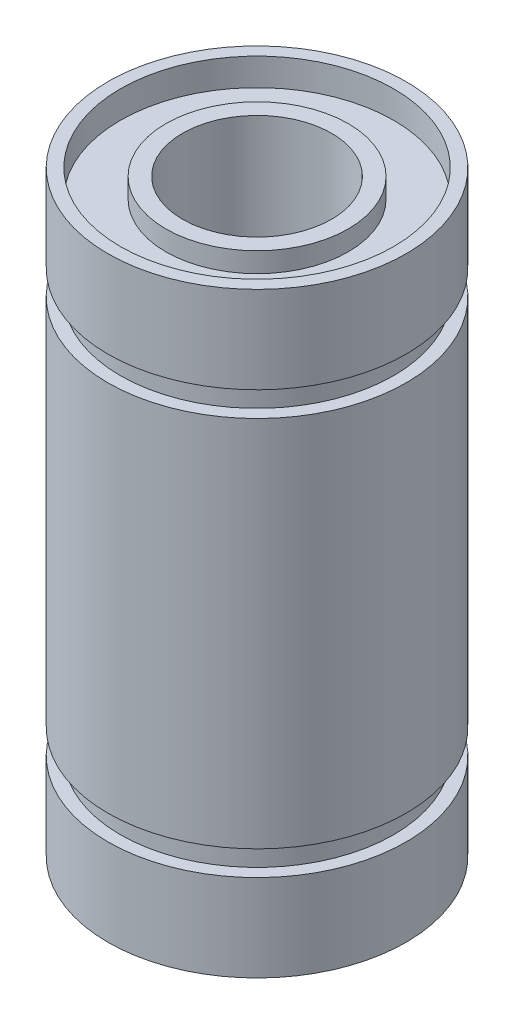
ISO-10303-21;
HEADER;
FILE_DESCRIPTION(('STEP AP214'),'2;1');
FILE_NAME('part.step','',(''),(''),'','','');
FILE_SCHEMA(('AUTOMOTIVE_DESIGN { 1 0 10303 214 1 1 1 1 }'));
ENDSEC;
DATA;
#1=APPLICATION_CONTEXT('core data for automotive mechanical design processes');
#2=APPLICATION_PROTOCOL_DEFINITION('international standard','automotive_design',2000,#1);
#3=PRODUCT_CONTEXT('',#1,'mechanical');
#4=PRODUCT('Part','Part','',(#3));
#5=PRODUCT_RELATED_PRODUCT_CATEGORY('part','',(#4));
#6=PRODUCT_DEFINITION_FORMATION('','',#4);
#7=PRODUCT_DEFINITION_CONTEXT('part definition',#1,'design');
#8=PRODUCT_DEFINITION('design','',#6,#7);
#9=PRODUCT_DEFINITION_SHAPE('','',#8);
#10=(LENGTH_UNIT() NAMED_UNIT(*) SI_UNIT(.MILLI.,.METRE.));
#11=(NAMED_UNIT(*) PLANE_ANGLE_UNIT() SI_UNIT($,.RADIAN.));
#12=(NAMED_UNIT(*) SI_UNIT($,.STERADIAN.) SOLID_ANGLE_UNIT());
#13=UNCERTAINTY_MEASURE_WITH_UNIT(LENGTH_MEASURE(1.E-05),#10,'distance_accuracy_value','');
#14=(GEOMETRIC_REPRESENTATION_CONTEXT(3) GLOBAL_UNCERTAINTY_ASSIGNED_CONTEXT((#13)) GLOBAL_UNIT_ASSIGNED_CONTEXT((#10,
#11,#12)) REPRESENTATION_CONTEXT('',''));
#15=CARTESIAN_POINT('',(0.,0.,0.));
#16=DIRECTION('',(0.,0.,1.));
#17=DIRECTION('',(1.,0.,0.));
#18=AXIS2_PLACEMENT_3D('',#15,#16,#17);
#19=CARTESIAN_POINT('',(0.,-12.,0.));
#20=DIRECTION('',(0.,1.,0.));
#21=DIRECTION('',(0.,0.,1.));
#22=AXIS2_PLACEMENT_3D('',#19,#20,#21);
#23=CYLINDRICAL_SURFACE('',#22,3.);
#24=CARTESIAN_POINT('',(0.,11.7,0.));
#25=DIRECTION('',(0.,1.,0.));
#26=DIRECTION('',(0.,0.,1.));
#27=AXIS2_PLACEMENT_3D('',#24,#25,#26);
#28=CIRCLE('',#27,3.);
#29=CARTESIAN_POINT('',(0.,11.7,3.));
#30=VERTEX_POINT('',#29);
#31=EDGE_CURVE('E72',#30,#30,#28,.T.);
#32=ORIENTED_EDGE('',*,*,#31,.T.);
#33=EDGE_LOOP('',(#32));
#34=FACE_BOUND('',#33,.T.);
#35=CARTESIAN_POINT('',(0.,-11.7,0.));
#36=DIRECTION('',(0.,1.,0.));
#37=DIRECTION('',(0.,0.,1.));
#38=AXIS2_PLACEMENT_3D('',#35,#36,#37);
#39=CIRCLE('',#38,3.);
#40=CARTESIAN_POINT('',(0.,-11.7,3.));
#41=VERTEX_POINT('',#40);
#42=EDGE_CURVE('E99',#41,#41,#39,.T.);
#43=ORIENTED_EDGE('',*,*,#42,.F.);
#44=EDGE_LOOP('',(#43));
#45=FACE_BOUND('',#44,.T.);
#46=ADVANCED_FACE('F45',(#34,#45),#23,.F.);
#47=CARTESIAN_POINT('',(0.,-12.,0.));
#48=DIRECTION('',(0.,1.,0.));
#49=DIRECTION('',(0.,0.,1.));
#50=AXIS2_PLACEMENT_3D('',#47,#48,#49);
#51=PLANE('',#50);
#52=CARTESIAN_POINT('',(0.,-12.,0.));
#53=DIRECTION('',(0.,1.,0.));
#54=DIRECTION('',(0.,0.,1.));
#55=AXIS2_PLACEMENT_3D('',#52,#53,#54);
#56=CIRCLE('',#55,6.);
#57=CARTESIAN_POINT('',(0.,-12.,6.));
#58=VERTEX_POINT('',#57);
#59=EDGE_CURVE('E49',#58,#58,#56,.T.);
#60=ORIENTED_EDGE('',*,*,#59,.F.);
#61=EDGE_LOOP('',(#60));
#62=FACE_BOUND('',#61,.T.);
#63=CARTESIAN_POINT('',(0.,-12.,0.));
#64=DIRECTION('',(0.,1.,0.));
#65=DIRECTION('',(0.,0.,1.));
#66=AXIS2_PLACEMENT_3D('',#63,#64,#65);
#67=CIRCLE('',#66,5.5);
#68=CARTESIAN_POINT('',(0.,-12.,5.5));
#69=VERTEX_POINT('',#68);
#70=EDGE_CURVE('E94',#69,#69,#67,.T.);
#71=ORIENTED_EDGE('',*,*,#70,.T.);
#72=EDGE_LOOP('',(#71));
#73=FACE_BOUND('',#72,.T.);
#74=ADVANCED_FACE('F133',(#62,#73),#51,.F.);
#75=CARTESIAN_POINT('',(0.,12.,0.));
#76=DIRECTION('',(0.,-1.,0.));
#77=DIRECTION('',(0.,0.,-1.));
#78=AXIS2_PLACEMENT_3D('',#75,#76,#77);
#79=CYLINDRICAL_SURFACE('',#78,6.);
#80=CARTESIAN_POINT('',(0.,7.5,0.));
#81=DIRECTION('',(0.,1.,0.));
#82=DIRECTION('',(0.,0.,1.));
#83=AXIS2_PLACEMENT_3D('',#80,#81,#82);
#84=CIRCLE('',#83,6.);
#85=CARTESIAN_POINT('',(0.,7.5,6.));
#86=VERTEX_POINT('',#85);
#87=EDGE_CURVE('E56',#86,#86,#84,.T.);
#88=ORIENTED_EDGE('',*,*,#87,.F.);
#89=EDGE_LOOP('',(#88));
#90=FACE_BOUND('',#89,.T.);
#91=CARTESIAN_POINT('',(0.,-7.5,0.));
#92=DIRECTION('',(0.,1.,0.));
#93=DIRECTION('',(0.,0.,1.));
#94=AXIS2_PLACEMENT_3D('',#91,#92,#93);
#95=CIRCLE('',#94,6.);
#96=CARTESIAN_POINT('',(0.,-7.5,6.));
#97=VERTEX_POINT('',#96);
#98=EDGE_CURVE('E84',#97,#97,#95,.T.);
#99=ORIENTED_EDGE('',*,*,#98,.T.);
#100=EDGE_LOOP('',(#99));
#101=FACE_BOUND('',#100,.T.);
#102=ADVANCED_FACE('F140',(#90,#101),#79,.T.);
#103=CARTESIAN_POINT('',(0.,12.,0.));
#104=DIRECTION('',(0.,1.,0.));
#105=DIRECTION('',(0.,0.,1.));
#106=AXIS2_PLACEMENT_3D('',#103,#104,#105);
#107=PLANE('',#106);
#108=CARTESIAN_POINT('',(0.,12.,0.));
#109=DIRECTION('',(0.,1.,0.));
#110=DIRECTION('',(0.,0.,1.));
#111=AXIS2_PLACEMENT_3D('',#108,#109,#110);
#112=CIRCLE('',#111,6.);
#113=CARTESIAN_POINT('',(0.,12.,6.));
#114=VERTEX_POINT('',#113);
#115=EDGE_CURVE('E10',#114,#114,#112,.T.);
#116=ORIENTED_EDGE('',*,*,#115,.T.);
#117=EDGE_LOOP('',(#116));
#118=FACE_BOUND('',#117,.T.);
#119=CARTESIAN_POINT('',(0.,12.,0.));
#120=DIRECTION('',(0.,1.,0.));
#121=DIRECTION('',(0.,0.,1.));
#122=AXIS2_PLACEMENT_3D('',#119,#120,#121);
#123=CIRCLE('',#122,5.5);
#124=CARTESIAN_POINT('',(0.,12.,5.5));
#125=VERTEX_POINT('',#124);
#126=EDGE_CURVE('E67',#125,#125,#123,.T.);
#127=ORIENTED_EDGE('',*,*,#126,.F.);
#128=EDGE_LOOP('',(#127));
#129=FACE_BOUND('',#128,.T.);
#130=ADVANCED_FACE('F146',(#118,#129),#107,.T.);
#131=CARTESIAN_POINT('',(0.,-8.5,0.));
#132=DIRECTION('',(0.,1.,0.));
#133=DIRECTION('',(0.,0.,1.));
#134=AXIS2_PLACEMENT_3D('',#131,#132,#133);
#135=CIRCLE('',#134,6.);
#136=CARTESIAN_POINT('',(0.,-8.5,6.));
#137=VERTEX_POINT('',#136);
#138=EDGE_CURVE('E85',#137,#137,#135,.T.);
#139=ORIENTED_EDGE('',*,*,#138,.F.);
#140=EDGE_LOOP('',(#139));
#141=FACE_BOUND('',#140,.T.);
#142=ORIENTED_EDGE('',*,*,#59,.T.);
#143=EDGE_LOOP('',(#142));
#144=FACE_BOUND('',#143,.T.);
#145=ADVANCED_FACE('F148',(#141,#144),#79,.T.);
#146=CARTESIAN_POINT('',(0.,8.5,0.));
#147=DIRECTION('',(0.,1.,0.));
#148=DIRECTION('',(0.,0.,1.));
#149=AXIS2_PLACEMENT_3D('',#146,#147,#148);
#150=CIRCLE('',#149,6.);
#151=CARTESIAN_POINT('',(0.,8.5,6.));
#152=VERTEX_POINT('',#151);
#153=EDGE_CURVE('E58',#152,#152,#150,.T.);
#154=ORIENTED_EDGE('',*,*,#153,.T.);
#155=EDGE_LOOP('',(#154));
#156=FACE_BOUND('',#155,.T.);
#157=ORIENTED_EDGE('',*,*,#115,.F.);
#158=EDGE_LOOP('',(#157));
#159=FACE_BOUND('',#158,.T.);
#160=ADVANCED_FACE('F47',(#156,#159),#79,.T.);
#161=CARTESIAN_POINT('',(0.,7.5,0.));
#162=DIRECTION('',(0.,1.,0.));
#163=DIRECTION('',(0.,0.,1.));
#164=AXIS2_PLACEMENT_3D('',#161,#162,#163);
#165=PLANE('',#164);
#166=CARTESIAN_POINT('',(0.,7.5,0.));
#167=DIRECTION('',(0.,1.,0.));
#168=DIRECTION('',(0.,0.,1.));
#169=AXIS2_PLACEMENT_3D('',#166,#167,#168);
#170=CIRCLE('',#169,5.5);
#171=CARTESIAN_POINT('',(0.,7.5,5.5));
#172=VERTEX_POINT('',#171);
#173=EDGE_CURVE('E61',#172,#172,#170,.T.);
#174=ORIENTED_EDGE('',*,*,#173,.F.);
#175=EDGE_LOOP('',(#174));
#176=FACE_BOUND('',#175,.T.);
#177=ORIENTED_EDGE('',*,*,#87,.T.);
#178=EDGE_LOOP('',(#177));
#179=FACE_BOUND('',#178,.T.);
#180=ADVANCED_FACE('F188',(#176,#179),#165,.T.);
#181=CARTESIAN_POINT('',(0.,8.5,0.));
#182=DIRECTION('',(0.,1.,0.));
#183=DIRECTION('',(0.,0.,1.));
#184=AXIS2_PLACEMENT_3D('',#181,#182,#183);
#185=PLANE('',#184);
#186=CARTESIAN_POINT('',(0.,8.5,0.));
#187=DIRECTION('',(0.,1.,0.));
#188=DIRECTION('',(0.,0.,1.));
#189=AXIS2_PLACEMENT_3D('',#186,#187,#188);
#190=CIRCLE('',#189,5.5);
#191=CARTESIAN_POINT('',(0.,8.5,5.5));
#192=VERTEX_POINT('',#191);
#193=EDGE_CURVE('E64',#192,#192,#190,.T.);
#194=ORIENTED_EDGE('',*,*,#193,.T.);
#195=EDGE_LOOP('',(#194));
#196=FACE_BOUND('',#195,.T.);
#197=ORIENTED_EDGE('',*,*,#153,.F.);
#198=EDGE_LOOP('',(#197));
#199=FACE_BOUND('',#198,.T.);
#200=ADVANCED_FACE('F144',(#196,#199),#185,.F.);
#201=CARTESIAN_POINT('',(0.,7.5,0.));
#202=DIRECTION('',(0.,1.,0.));
#203=DIRECTION('',(0.,0.,1.));
#204=AXIS2_PLACEMENT_3D('',#201,#202,#203);
#205=CYLINDRICAL_SURFACE('',#204,5.5);
#206=ORIENTED_EDGE('',*,*,#173,.T.);
#207=EDGE_LOOP('',(#206));
#208=FACE_BOUND('',#207,.T.);
#209=ORIENTED_EDGE('',*,*,#193,.F.);
#210=EDGE_LOOP('',(#209));
#211=FACE_BOUND('',#210,.T.);
#212=ADVANCED_FACE('F163',(#208,#211),#205,.T.);
#213=CARTESIAN_POINT('',(0.,10.5,0.));
#214=DIRECTION('',(0.,1.,0.));
#215=DIRECTION('',(0.,0.,1.));
#216=AXIS2_PLACEMENT_3D('',#213,#214,#215);
#217=CYLINDRICAL_SURFACE('',#216,5.5);
#218=ORIENTED_EDGE('',*,*,#126,.T.);
#219=EDGE_LOOP('',(#218));
#220=FACE_BOUND('',#219,.T.);
#221=CARTESIAN_POINT('',(0.,10.9,0.));
#222=DIRECTION('',(0.,1.,0.));
#223=DIRECTION('',(0.,0.,1.));
#224=AXIS2_PLACEMENT_3D('',#221,#222,#223);
#225=CIRCLE('',#224,5.5);
#226=CARTESIAN_POINT('',(0.,10.9,5.5));
#227=VERTEX_POINT('',#226);
#228=EDGE_CURVE('E81',#227,#227,#225,.T.);
#229=ORIENTED_EDGE('',*,*,#228,.F.);
#230=EDGE_LOOP('',(#229));
#231=FACE_BOUND('',#230,.T.);
#232=ADVANCED_FACE('F160',(#220,#231),#217,.F.);
#233=CARTESIAN_POINT('',(0.,11.7,-3.));
#234=DIRECTION('',(0.,1.,0.));
#235=DIRECTION('',(0.,0.,1.));
#236=AXIS2_PLACEMENT_3D('',#233,#234,#235);
#237=PLANE('',#236);
#238=CARTESIAN_POINT('',(0.,11.7,0.));
#239=DIRECTION('',(0.,1.,0.));
#240=DIRECTION('',(0.,0.,1.));
#241=AXIS2_PLACEMENT_3D('',#238,#239,#240);
#242=CIRCLE('',#241,3.67076728218051);
#243=CARTESIAN_POINT('',(0.,11.7,3.67076728218051));
#244=VERTEX_POINT('',#243);
#245=EDGE_CURVE('E75',#244,#244,#242,.T.);
#246=ORIENTED_EDGE('',*,*,#245,.T.);
#247=EDGE_LOOP('',(#246));
#248=FACE_BOUND('',#247,.T.);
#249=ORIENTED_EDGE('',*,*,#31,.F.);
#250=EDGE_LOOP('',(#249));
#251=FACE_BOUND('',#250,.T.);
#252=ADVANCED_FACE('F162',(#248,#251),#237,.T.);
#253=CARTESIAN_POINT('',(0.,10.5,0.));
#254=DIRECTION('',(0.,1.,0.));
#255=DIRECTION('',(0.,0.,1.));
#256=AXIS2_PLACEMENT_3D('',#253,#254,#255);
#257=CYLINDRICAL_SURFACE('',#256,3.67076728218051);
#258=CARTESIAN_POINT('',(0.,10.9,0.));
#259=DIRECTION('',(0.,1.,0.));
#260=DIRECTION('',(0.,0.,1.));
#261=AXIS2_PLACEMENT_3D('',#258,#259,#260);
#262=CIRCLE('',#261,3.67076728218051);
#263=CARTESIAN_POINT('',(0.,10.9,3.67076728218051));
#264=VERTEX_POINT('',#263);
#265=EDGE_CURVE('E78',#264,#264,#262,.T.);
#266=ORIENTED_EDGE('',*,*,#265,.T.);
#267=EDGE_LOOP('',(#266));
#268=FACE_BOUND('',#267,.T.);
#269=ORIENTED_EDGE('',*,*,#245,.F.);
#270=EDGE_LOOP('',(#269));
#271=FACE_BOUND('',#270,.T.);
#272=ADVANCED_FACE('F171',(#268,#271),#257,.T.);
#273=CARTESIAN_POINT('',(0.,10.9,-3.67076728218051));
#274=DIRECTION('',(0.,1.,0.));
#275=DIRECTION('',(0.,0.,1.));
#276=AXIS2_PLACEMENT_3D('',#273,#274,#275);
#277=PLANE('',#276);
#278=ORIENTED_EDGE('',*,*,#228,.T.);
#279=EDGE_LOOP('',(#278));
#280=FACE_BOUND('',#279,.T.);
#281=ORIENTED_EDGE('',*,*,#265,.F.);
#282=EDGE_LOOP('',(#281));
#283=FACE_BOUND('',#282,.T.);
#284=ADVANCED_FACE('F167',(#280,#283),#277,.T.);
#285=CARTESIAN_POINT('',(0.,-7.5,0.));
#286=DIRECTION('',(0.,-1.,0.));
#287=DIRECTION('',(0.,0.,1.));
#288=AXIS2_PLACEMENT_3D('',#285,#286,#287);
#289=PLANE('',#288);
#290=ORIENTED_EDGE('',*,*,#98,.F.);
#291=EDGE_LOOP('',(#290));
#292=FACE_BOUND('',#291,.T.);
#293=CARTESIAN_POINT('',(0.,-7.5,0.));
#294=DIRECTION('',(0.,1.,0.));
#295=DIRECTION('',(0.,0.,1.));
#296=AXIS2_PLACEMENT_3D('',#293,#294,#295);
#297=CIRCLE('',#296,5.5);
#298=CARTESIAN_POINT('',(0.,-7.5,5.5));
#299=VERTEX_POINT('',#298);
#300=EDGE_CURVE('E88',#299,#299,#297,.T.);
#301=ORIENTED_EDGE('',*,*,#300,.T.);
#302=EDGE_LOOP('',(#301));
#303=FACE_BOUND('',#302,.T.);
#304=ADVANCED_FACE('F170',(#292,#303),#289,.T.);
#305=CARTESIAN_POINT('',(0.,-8.5,0.));
#306=DIRECTION('',(0.,-1.,0.));
#307=DIRECTION('',(0.,0.,1.));
#308=AXIS2_PLACEMENT_3D('',#305,#306,#307);
#309=PLANE('',#308);
#310=ORIENTED_EDGE('',*,*,#138,.T.);
#311=EDGE_LOOP('',(#310));
#312=FACE_BOUND('',#311,.T.);
#313=CARTESIAN_POINT('',(0.,-8.5,0.));
#314=DIRECTION('',(0.,1.,0.));
#315=DIRECTION('',(0.,0.,1.));
#316=AXIS2_PLACEMENT_3D('',#313,#314,#315);
#317=CIRCLE('',#316,5.5);
#318=CARTESIAN_POINT('',(0.,-8.5,5.5));
#319=VERTEX_POINT('',#318);
#320=EDGE_CURVE('E91',#319,#319,#317,.T.);
#321=ORIENTED_EDGE('',*,*,#320,.F.);
#322=EDGE_LOOP('',(#321));
#323=FACE_BOUND('',#322,.T.);
#324=ADVANCED_FACE('F205',(#312,#323),#309,.F.);
#325=CARTESIAN_POINT('',(0.,-7.5,0.));
#326=DIRECTION('',(0.,-1.,0.));
#327=DIRECTION('',(0.,0.,-1.));
#328=AXIS2_PLACEMENT_3D('',#325,#326,#327);
#329=CYLINDRICAL_SURFACE('',#328,5.5);
#330=ORIENTED_EDGE('',*,*,#300,.F.);
#331=EDGE_LOOP('',(#330));
#332=FACE_BOUND('',#331,.T.);
#333=ORIENTED_EDGE('',*,*,#320,.T.);
#334=EDGE_LOOP('',(#333));
#335=FACE_BOUND('',#334,.T.);
#336=ADVANCED_FACE('F209',(#332,#335),#329,.T.);
#337=CARTESIAN_POINT('',(0.,-10.5,0.));
#338=DIRECTION('',(0.,-1.,0.));
#339=DIRECTION('',(0.,0.,1.));
#340=AXIS2_PLACEMENT_3D('',#337,#338,#339);
#341=CYLINDRICAL_SURFACE('',#340,5.5);
#342=ORIENTED_EDGE('',*,*,#70,.F.);
#343=EDGE_LOOP('',(#342));
#344=FACE_BOUND('',#343,.T.);
#345=CARTESIAN_POINT('',(0.,-10.9,0.));
#346=DIRECTION('',(0.,1.,0.));
#347=DIRECTION('',(0.,0.,1.));
#348=AXIS2_PLACEMENT_3D('',#345,#346,#347);
#349=CIRCLE('',#348,5.5);
#350=CARTESIAN_POINT('',(0.,-10.9,5.5));
#351=VERTEX_POINT('',#350);
#352=EDGE_CURVE('E108',#351,#351,#349,.T.);
#353=ORIENTED_EDGE('',*,*,#352,.T.);
#354=EDGE_LOOP('',(#353));
#355=FACE_BOUND('',#354,.T.);
#356=ADVANCED_FACE('F112',(#344,#355),#341,.F.);
#357=CARTESIAN_POINT('',(0.,-11.7,-3.));
#358=DIRECTION('',(0.,-1.,0.));
#359=DIRECTION('',(0.,0.,1.));
#360=AXIS2_PLACEMENT_3D('',#357,#358,#359);
#361=PLANE('',#360);
#362=CARTESIAN_POINT('',(0.,-11.7,0.));
#363=DIRECTION('',(0.,1.,0.));
#364=DIRECTION('',(0.,0.,1.));
#365=AXIS2_PLACEMENT_3D('',#362,#363,#364);
#366=CIRCLE('',#365,3.67076728218051);
#367=CARTESIAN_POINT('',(0.,-11.7,3.67076728218051));
#368=VERTEX_POINT('',#367);
#369=EDGE_CURVE('E102',#368,#368,#366,.T.);
#370=ORIENTED_EDGE('',*,*,#369,.F.);
#371=EDGE_LOOP('',(#370));
#372=FACE_BOUND('',#371,.T.);
#373=ORIENTED_EDGE('',*,*,#42,.T.);
#374=EDGE_LOOP('',(#373));
#375=FACE_BOUND('',#374,.T.);
#376=ADVANCED_FACE('F123',(#372,#375),#361,.T.);
#377=CARTESIAN_POINT('',(0.,-10.5,0.));
#378=DIRECTION('',(0.,-1.,0.));
#379=DIRECTION('',(0.,0.,1.));
#380=AXIS2_PLACEMENT_3D('',#377,#378,#379);
#381=CYLINDRICAL_SURFACE('',#380,3.67076728218051);
#382=CARTESIAN_POINT('',(0.,-10.9,0.));
#383=DIRECTION('',(0.,1.,0.));
#384=DIRECTION('',(0.,0.,1.));
#385=AXIS2_PLACEMENT_3D('',#382,#383,#384);
#386=CIRCLE('',#385,3.67076728218051);
#387=CARTESIAN_POINT('',(0.,-10.9,3.67076728218051));
#388=VERTEX_POINT('',#387);
#389=EDGE_CURVE('E105',#388,#388,#386,.T.);
#390=ORIENTED_EDGE('',*,*,#389,.F.);
#391=EDGE_LOOP('',(#390));
#392=FACE_BOUND('',#391,.T.);
#393=ORIENTED_EDGE('',*,*,#369,.T.);
#394=EDGE_LOOP('',(#393));
#395=FACE_BOUND('',#394,.T.);
#396=ADVANCED_FACE('F117',(#392,#395),#381,.T.);
#397=CARTESIAN_POINT('',(0.,-10.9,-3.67076728218051));
#398=DIRECTION('',(0.,-1.,0.));
#399=DIRECTION('',(0.,0.,1.));
#400=AXIS2_PLACEMENT_3D('',#397,#398,#399);
#401=PLANE('',#400);
#402=ORIENTED_EDGE('',*,*,#352,.F.);
#403=EDGE_LOOP('',(#402));
#404=FACE_BOUND('',#403,.T.);
#405=ORIENTED_EDGE('',*,*,#389,.T.);
#406=EDGE_LOOP('',(#405));
#407=FACE_BOUND('',#406,.T.);
#408=ADVANCED_FACE('F114',(#404,#407),#401,.T.);
#409=CLOSED_SHELL('',(#46,#74,#102,#130,#145,#160,#180,#200,#212,#232,#252,#272,#284,#304,#324,
#336,#356,#376,#396,#408));
#410=MANIFOLD_SOLID_BREP('B2',#409);
#411=ADVANCED_BREP_SHAPE_REPRESENTATION('',(#18,#410),#14);
#412=SHAPE_DEFINITION_REPRESENTATION(#9,#411);
ENDSEC;
END-ISO-10303-21;
